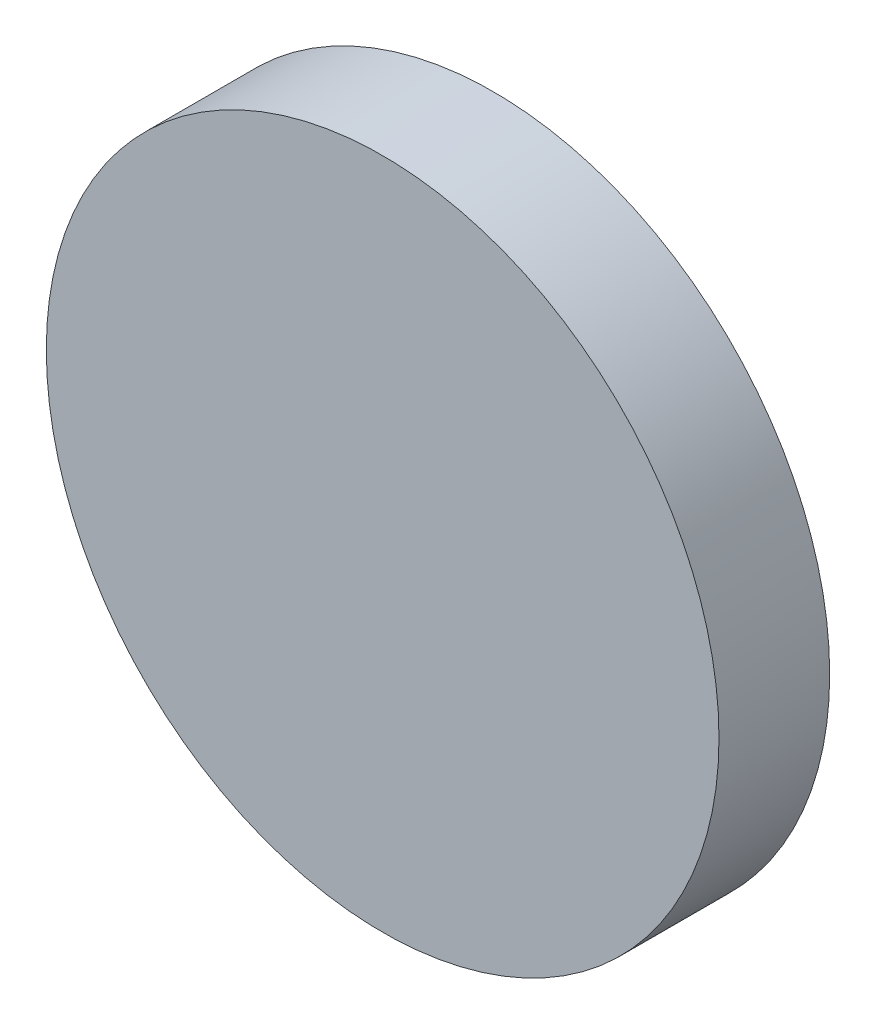
ISO-10303-21;
HEADER;
FILE_DESCRIPTION(('STEP AP214'),'2;1');
FILE_NAME('part.step','',(''),(''),'','','');
FILE_SCHEMA(('AUTOMOTIVE_DESIGN { 1 0 10303 214 1 1 1 1 }'));
ENDSEC;
DATA;
#1=APPLICATION_CONTEXT('core data for automotive mechanical design processes');
#2=APPLICATION_PROTOCOL_DEFINITION('international standard','automotive_design',2000,#1);
#3=PRODUCT_CONTEXT('',#1,'mechanical');
#4=PRODUCT('Part','Part','',(#3));
#5=PRODUCT_RELATED_PRODUCT_CATEGORY('part','',(#4));
#6=PRODUCT_DEFINITION_FORMATION('','',#4);
#7=PRODUCT_DEFINITION_CONTEXT('part definition',#1,'design');
#8=PRODUCT_DEFINITION('design','',#6,#7);
#9=PRODUCT_DEFINITION_SHAPE('','',#8);
#10=(LENGTH_UNIT() NAMED_UNIT(*) SI_UNIT(.MILLI.,.METRE.));
#11=(NAMED_UNIT(*) PLANE_ANGLE_UNIT() SI_UNIT($,.RADIAN.));
#12=(NAMED_UNIT(*) SI_UNIT($,.STERADIAN.) SOLID_ANGLE_UNIT());
#13=UNCERTAINTY_MEASURE_WITH_UNIT(LENGTH_MEASURE(1.E-05),#10,'distance_accuracy_value','');
#14=(GEOMETRIC_REPRESENTATION_CONTEXT(3) GLOBAL_UNCERTAINTY_ASSIGNED_CONTEXT((#13)) GLOBAL_UNIT_ASSIGNED_CONTEXT((#10,
#11,#12)) REPRESENTATION_CONTEXT('',''));
#15=CARTESIAN_POINT('',(0.,0.,0.));
#16=DIRECTION('',(0.,0.,1.));
#17=DIRECTION('',(1.,0.,0.));
#18=AXIS2_PLACEMENT_3D('',#15,#16,#17);
#19=CARTESIAN_POINT('',(0.,0.,13.));
#20=DIRECTION('',(0.,0.,-1.));
#21=DIRECTION('',(-1.,0.,0.));
#22=AXIS2_PLACEMENT_3D('',#19,#20,#21);
#23=CYLINDRICAL_SURFACE('',#22,39.5);
#24=CARTESIAN_POINT('',(0.,0.,13.));
#25=DIRECTION('',(0.,0.,1.));
#26=DIRECTION('',(1.,0.,0.));
#27=AXIS2_PLACEMENT_3D('',#24,#25,#26);
#28=CIRCLE('',#27,39.5);
#29=CARTESIAN_POINT('',(-39.5,0.,13.));
#30=VERTEX_POINT('',#29);
#31=EDGE_CURVE('E10',#30,#30,#28,.T.);
#32=CARTESIAN_POINT('',(0.,0.,0.));
#33=DIRECTION('',(0.,0.,1.));
#34=DIRECTION('',(1.,0.,0.));
#35=AXIS2_PLACEMENT_3D('',#32,#33,#34);
#36=CIRCLE('',#35,39.5);
#37=CARTESIAN_POINT('',(-39.5,0.,0.));
#38=VERTEX_POINT('',#37);
#39=EDGE_CURVE('E42',#38,#38,#36,.T.);
#40=CARTESIAN_POINT('',(-39.5,0.,13.));
#41=CARTESIAN_POINT('',(-39.5,0.,12.8645833333333));
#42=CARTESIAN_POINT('',(-39.5,0.,12.7291666666667));
#43=CARTESIAN_POINT('',(-39.5,0.,12.4583333333333));
#44=CARTESIAN_POINT('',(-39.5,0.,12.3229166666667));
#45=CARTESIAN_POINT('',(-39.5,0.,12.0520833333333));
#46=CARTESIAN_POINT('',(-39.5,0.,11.9166666666667));
#47=CARTESIAN_POINT('',(-39.5,0.,11.6458333333333));
#48=CARTESIAN_POINT('',(-39.5,0.,11.5104166666667));
#49=CARTESIAN_POINT('',(-39.5,0.,11.2395833333333));
#50=CARTESIAN_POINT('',(-39.5,0.,11.1041666666667));
#51=CARTESIAN_POINT('',(-39.5,0.,10.8333333333333));
#52=CARTESIAN_POINT('',(-39.5,0.,10.6979166666667));
#53=CARTESIAN_POINT('',(-39.5,0.,10.4270833333333));
#54=CARTESIAN_POINT('',(-39.5,0.,10.2916666666667));
#55=CARTESIAN_POINT('',(-39.5,0.,10.0208333333333));
#56=CARTESIAN_POINT('',(-39.5,0.,9.88541666666667));
#57=CARTESIAN_POINT('',(-39.5,0.,9.61458333333333));
#58=CARTESIAN_POINT('',(-39.5,0.,9.47916666666667));
#59=CARTESIAN_POINT('',(-39.5,0.,9.20833333333333));
#60=CARTESIAN_POINT('',(-39.5,0.,9.07291666666667));
#61=CARTESIAN_POINT('',(-39.5,0.,8.80208333333333));
#62=CARTESIAN_POINT('',(-39.5,0.,8.66666666666667));
#63=CARTESIAN_POINT('',(-39.5,0.,8.39583333333333));
#64=CARTESIAN_POINT('',(-39.5,0.,8.26041666666667));
#65=CARTESIAN_POINT('',(-39.5,0.,7.98958333333333));
#66=CARTESIAN_POINT('',(-39.5,0.,7.85416666666667));
#67=CARTESIAN_POINT('',(-39.5,0.,7.58333333333333));
#68=CARTESIAN_POINT('',(-39.5,0.,7.44791666666667));
#69=CARTESIAN_POINT('',(-39.5,0.,7.17708333333333));
#70=CARTESIAN_POINT('',(-39.5,0.,7.04166666666667));
#71=CARTESIAN_POINT('',(-39.5,0.,6.77083333333333));
#72=CARTESIAN_POINT('',(-39.5,0.,6.63541666666667));
#73=CARTESIAN_POINT('',(-39.5,0.,6.36458333333333));
#74=CARTESIAN_POINT('',(-39.5,0.,6.22916666666667));
#75=CARTESIAN_POINT('',(-39.5,0.,5.95833333333333));
#76=CARTESIAN_POINT('',(-39.5,0.,5.82291666666667));
#77=CARTESIAN_POINT('',(-39.5,0.,5.55208333333333));
#78=CARTESIAN_POINT('',(-39.5,0.,5.41666666666667));
#79=CARTESIAN_POINT('',(-39.5,0.,5.14583333333333));
#80=CARTESIAN_POINT('',(-39.5,0.,5.01041666666667));
#81=CARTESIAN_POINT('',(-39.5,0.,4.73958333333333));
#82=CARTESIAN_POINT('',(-39.5,0.,4.60416666666667));
#83=CARTESIAN_POINT('',(-39.5,0.,4.33333333333333));
#84=CARTESIAN_POINT('',(-39.5,0.,4.19791666666667));
#85=CARTESIAN_POINT('',(-39.5,0.,3.92708333333333));
#86=CARTESIAN_POINT('',(-39.5,0.,3.79166666666667));
#87=CARTESIAN_POINT('',(-39.5,0.,3.52083333333333));
#88=CARTESIAN_POINT('',(-39.5,0.,3.38541666666667));
#89=CARTESIAN_POINT('',(-39.5,0.,3.11458333333333));
#90=CARTESIAN_POINT('',(-39.5,0.,2.97916666666667));
#91=CARTESIAN_POINT('',(-39.5,0.,2.70833333333333));
#92=CARTESIAN_POINT('',(-39.5,0.,2.57291666666667));
#93=CARTESIAN_POINT('',(-39.5,0.,2.30208333333333));
#94=CARTESIAN_POINT('',(-39.5,0.,2.16666666666667));
#95=CARTESIAN_POINT('',(-39.5,0.,1.89583333333333));
#96=CARTESIAN_POINT('',(-39.5,0.,1.76041666666667));
#97=CARTESIAN_POINT('',(-39.5,0.,1.48958333333333));
#98=CARTESIAN_POINT('',(-39.5,0.,1.35416666666667));
#99=CARTESIAN_POINT('',(-39.5,0.,1.08333333333333));
#100=CARTESIAN_POINT('',(-39.5,0.,0.947916666666667));
#101=CARTESIAN_POINT('',(-39.5,0.,0.677083333333334));
#102=CARTESIAN_POINT('',(-39.5,0.,0.541666666666667));
#103=CARTESIAN_POINT('',(-39.5,0.,0.270833333333334));
#104=CARTESIAN_POINT('',(-39.5,0.,0.135416666666667));
#105=CARTESIAN_POINT('',(-39.5,0.,0.));
#106=B_SPLINE_CURVE_WITH_KNOTS('',3,(#40,#41,#42,#43,#44,#45,#46,#47,#48,#49,#50,#51,#52,#53,
#54,#55,#56,#57,#58,#59,#60,#61,#62,#63,#64,#65,#66,#67,#68,#69,#70,#71,#72,#73,#74,#75,#76,#77,
#78,#79,#80,#81,#82,#83,#84,#85,#86,#87,#88,#89,#90,#91,#92,#93,#94,#95,#96,#97,#98,#99,#100,
#101,#102,#103,#104,#105),.UNSPECIFIED.,.F.,.F.,(4,2,2,2,2,2,2,2,2,2,2,2,2,2,2,2,2,2,2,2,2,2,2,
2,2,2,2,2,2,2,2,2,4),(0.,0.406249999999999,0.812499999999999,1.21875,1.625,2.03125,2.4375,
2.84375,3.25,3.65625,4.0625,4.46875,4.875,5.28125,5.6875,6.09375,6.5,6.90625,7.3125,7.71875,
8.125,8.53125,8.9375,9.34375,9.75,10.15625,10.5625,10.96875,11.375,11.78125,12.1875,12.59375,
13.),.UNSPECIFIED.);
#107=EDGE_CURVE('BSEAM39',#30,#38,#106,.T.);
#108=ORIENTED_EDGE('',*,*,#31,.F.);
#109=ORIENTED_EDGE('',*,*,#39,.T.);
#110=ORIENTED_EDGE('',*,*,#107,.T.);
#111=ORIENTED_EDGE('',*,*,#107,.F.);
#112=EDGE_LOOP('',(#108,#110,#109,#111));
#113=FACE_BOUND('',#112,.T.);
#114=ADVANCED_FACE('F39',(#113),#23,.T.);
#115=CARTESIAN_POINT('',(0.,0.,13.));
#116=DIRECTION('',(0.,0.,1.));
#117=DIRECTION('',(1.,0.,0.));
#118=AXIS2_PLACEMENT_3D('',#115,#116,#117);
#119=PLANE('',#118);
#120=ORIENTED_EDGE('',*,*,#31,.T.);
#121=EDGE_LOOP('',(#120));
#122=FACE_BOUND('',#121,.T.);
#123=ADVANCED_FACE('F56',(#122),#119,.T.);
#124=CARTESIAN_POINT('',(0.,0.,0.));
#125=DIRECTION('',(0.,0.,1.));
#126=DIRECTION('',(1.,0.,0.));
#127=AXIS2_PLACEMENT_3D('',#124,#125,#126);
#128=PLANE('',#127);
#129=ORIENTED_EDGE('',*,*,#39,.F.);
#130=EDGE_LOOP('',(#129));
#131=FACE_BOUND('',#130,.T.);
#132=ADVANCED_FACE('F54',(#131),#128,.F.);
#133=CLOSED_SHELL('',(#114,#123,#132));
#134=MANIFOLD_SOLID_BREP('B2',#133);
#135=ADVANCED_BREP_SHAPE_REPRESENTATION('',(#18,#134),#14);
#136=SHAPE_DEFINITION_REPRESENTATION(#9,#135);
ENDSEC;
END-ISO-10303-21;
